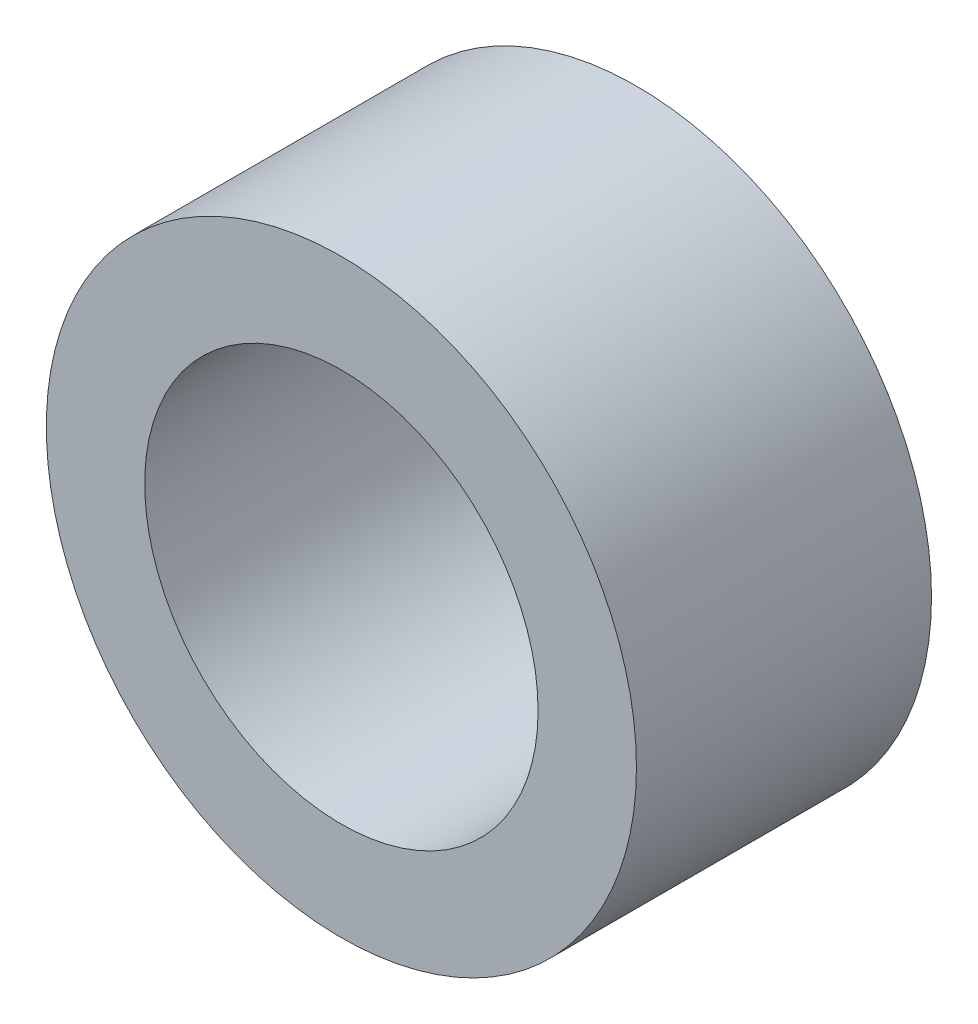
ISO-10303-21;
HEADER;
FILE_DESCRIPTION(('STEP AP214'),'2;1');
FILE_NAME('part.step','',(''),(''),'','','');
FILE_SCHEMA(('AUTOMOTIVE_DESIGN { 1 0 10303 214 1 1 1 1 }'));
ENDSEC;
DATA;
#1=APPLICATION_CONTEXT('core data for automotive mechanical design processes');
#2=APPLICATION_PROTOCOL_DEFINITION('international standard','automotive_design',2000,#1);
#3=PRODUCT_CONTEXT('',#1,'mechanical');
#4=PRODUCT('Part','Part','',(#3));
#5=PRODUCT_RELATED_PRODUCT_CATEGORY('part','',(#4));
#6=PRODUCT_DEFINITION_FORMATION('','',#4);
#7=PRODUCT_DEFINITION_CONTEXT('part definition',#1,'design');
#8=PRODUCT_DEFINITION('design','',#6,#7);
#9=PRODUCT_DEFINITION_SHAPE('','',#8);
#10=(LENGTH_UNIT() NAMED_UNIT(*) SI_UNIT(.MILLI.,.METRE.));
#11=(NAMED_UNIT(*) PLANE_ANGLE_UNIT() SI_UNIT($,.RADIAN.));
#12=(NAMED_UNIT(*) SI_UNIT($,.STERADIAN.) SOLID_ANGLE_UNIT());
#13=UNCERTAINTY_MEASURE_WITH_UNIT(LENGTH_MEASURE(1.E-05),#10,'distance_accuracy_value','');
#14=(GEOMETRIC_REPRESENTATION_CONTEXT(3) GLOBAL_UNCERTAINTY_ASSIGNED_CONTEXT((#13)) GLOBAL_UNIT_ASSIGNED_CONTEXT((#10,
#11,#12)) REPRESENTATION_CONTEXT('',''));
#15=CARTESIAN_POINT('',(0.,0.,0.));
#16=DIRECTION('',(0.,0.,1.));
#17=DIRECTION('',(1.,0.,0.));
#18=AXIS2_PLACEMENT_3D('',#15,#16,#17);
#19=CARTESIAN_POINT('',(0.,0.,3.));
#20=DIRECTION('',(0.,0.,1.));
#21=DIRECTION('',(1.,0.,0.));
#22=AXIS2_PLACEMENT_3D('',#19,#20,#21);
#23=PLANE('',#22);
#24=CARTESIAN_POINT('',(0.,0.,3.));
#25=DIRECTION('',(0.,0.,1.));
#26=DIRECTION('',(1.,0.,0.));
#27=AXIS2_PLACEMENT_3D('',#24,#25,#26);
#28=CIRCLE('',#27,3.);
#29=CARTESIAN_POINT('',(3.,0.,3.));
#30=VERTEX_POINT('',#29);
#31=EDGE_CURVE('E10',#30,#30,#28,.T.);
#32=ORIENTED_EDGE('',*,*,#31,.T.);
#33=EDGE_LOOP('',(#32));
#34=FACE_BOUND('',#33,.T.);
#35=CARTESIAN_POINT('',(0.,0.,3.));
#36=DIRECTION('',(0.,0.,1.));
#37=DIRECTION('',(1.,0.,0.));
#38=AXIS2_PLACEMENT_3D('',#35,#36,#37);
#39=CIRCLE('',#38,2.);
#40=CARTESIAN_POINT('',(2.,0.,3.));
#41=VERTEX_POINT('',#40);
#42=EDGE_CURVE('E51',#41,#41,#39,.T.);
#43=ORIENTED_EDGE('',*,*,#42,.F.);
#44=EDGE_LOOP('',(#43));
#45=FACE_BOUND('',#44,.T.);
#46=ADVANCED_FACE('F40',(#34,#45),#23,.T.);
#47=CARTESIAN_POINT('',(0.,0.,0.));
#48=DIRECTION('',(0.,0.,1.));
#49=DIRECTION('',(1.,0.,0.));
#50=AXIS2_PLACEMENT_3D('',#47,#48,#49);
#51=PLANE('',#50);
#52=CARTESIAN_POINT('',(0.,0.,0.));
#53=DIRECTION('',(0.,0.,1.));
#54=DIRECTION('',(1.,0.,0.));
#55=AXIS2_PLACEMENT_3D('',#52,#53,#54);
#56=CIRCLE('',#55,3.);
#57=CARTESIAN_POINT('',(3.,0.,0.));
#58=VERTEX_POINT('',#57);
#59=EDGE_CURVE('E44',#58,#58,#56,.T.);
#60=ORIENTED_EDGE('',*,*,#59,.F.);
#61=EDGE_LOOP('',(#60));
#62=FACE_BOUND('',#61,.T.);
#63=CARTESIAN_POINT('',(0.,0.,0.));
#64=DIRECTION('',(0.,0.,1.));
#65=DIRECTION('',(1.,0.,0.));
#66=AXIS2_PLACEMENT_3D('',#63,#64,#65);
#67=CIRCLE('',#66,2.);
#68=CARTESIAN_POINT('',(2.,0.,0.));
#69=VERTEX_POINT('',#68);
#70=EDGE_CURVE('E53',#69,#69,#67,.T.);
#71=ORIENTED_EDGE('',*,*,#70,.T.);
#72=EDGE_LOOP('',(#71));
#73=FACE_BOUND('',#72,.T.);
#74=ADVANCED_FACE('F63',(#62,#73),#51,.F.);
#75=CARTESIAN_POINT('',(0.,0.,3.));
#76=DIRECTION('',(0.,0.,-1.));
#77=DIRECTION('',(-1.,0.,0.));
#78=AXIS2_PLACEMENT_3D('',#75,#76,#77);
#79=CYLINDRICAL_SURFACE('',#78,3.);
#80=ORIENTED_EDGE('',*,*,#31,.F.);
#81=EDGE_LOOP('',(#80));
#82=FACE_BOUND('',#81,.T.);
#83=ORIENTED_EDGE('',*,*,#59,.T.);
#84=EDGE_LOOP('',(#83));
#85=FACE_BOUND('',#84,.T.);
#86=ADVANCED_FACE('F42',(#82,#85),#79,.T.);
#87=CARTESIAN_POINT('',(0.,0.,3.));
#88=DIRECTION('',(0.,0.,-1.));
#89=DIRECTION('',(-1.,0.,0.));
#90=AXIS2_PLACEMENT_3D('',#87,#88,#89);
#91=CYLINDRICAL_SURFACE('',#90,2.);
#92=ORIENTED_EDGE('',*,*,#42,.T.);
#93=EDGE_LOOP('',(#92));
#94=FACE_BOUND('',#93,.T.);
#95=ORIENTED_EDGE('',*,*,#70,.F.);
#96=EDGE_LOOP('',(#95));
#97=FACE_BOUND('',#96,.T.);
#98=ADVANCED_FACE('F59',(#94,#97),#91,.F.);
#99=CLOSED_SHELL('',(#46,#74,#86,#98));
#100=MANIFOLD_SOLID_BREP('B2',#99);
#101=ADVANCED_BREP_SHAPE_REPRESENTATION('',(#18,#100),#14);
#102=SHAPE_DEFINITION_REPRESENTATION(#9,#101);
ENDSEC;
END-ISO-10303-21;
